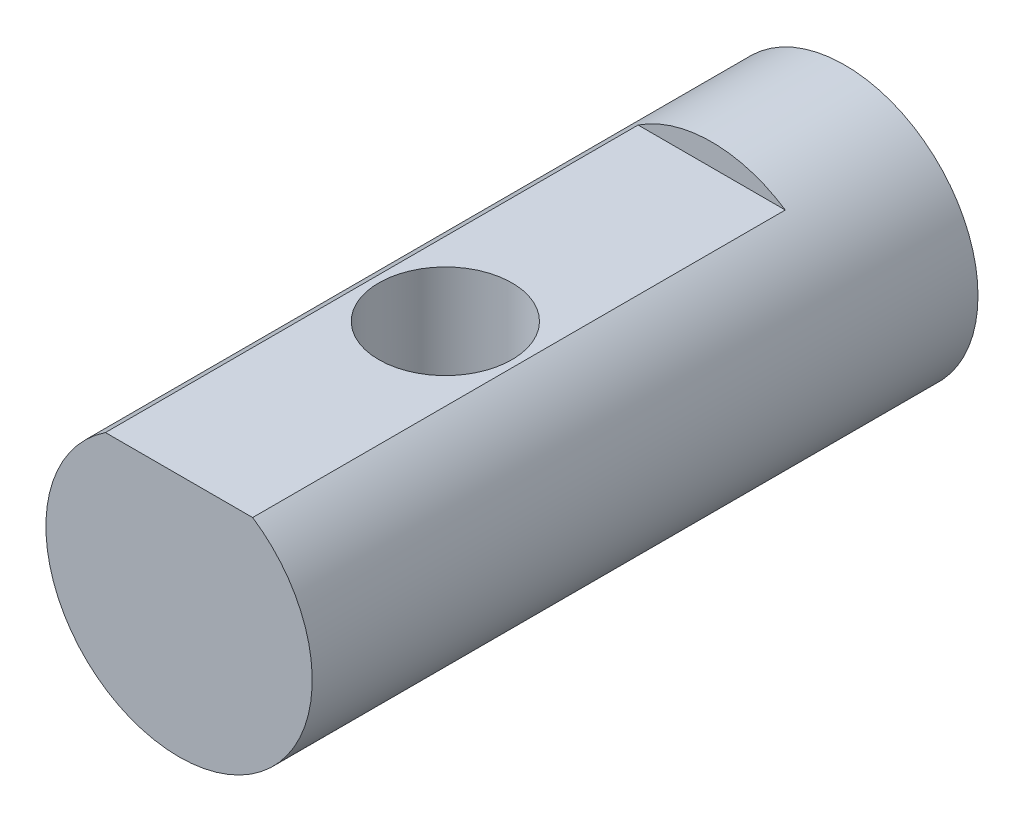
ISO-10303-21;
HEADER;
FILE_DESCRIPTION(('STEP AP214'),'2;1');
FILE_NAME('part.step','',(''),(''),'','','');
FILE_SCHEMA(('AUTOMOTIVE_DESIGN { 1 0 10303 214 1 1 1 1 }'));
ENDSEC;
DATA;
#1=APPLICATION_CONTEXT('core data for automotive mechanical design processes');
#2=APPLICATION_PROTOCOL_DEFINITION('international standard','automotive_design',2000,#1);
#3=PRODUCT_CONTEXT('',#1,'mechanical');
#4=PRODUCT('Part','Part','',(#3));
#5=PRODUCT_RELATED_PRODUCT_CATEGORY('part','',(#4));
#6=PRODUCT_DEFINITION_FORMATION('','',#4);
#7=PRODUCT_DEFINITION_CONTEXT('part definition',#1,'design');
#8=PRODUCT_DEFINITION('design','',#6,#7);
#9=PRODUCT_DEFINITION_SHAPE('','',#8);
#10=(LENGTH_UNIT() NAMED_UNIT(*) SI_UNIT(.MILLI.,.METRE.));
#11=(NAMED_UNIT(*) PLANE_ANGLE_UNIT() SI_UNIT($,.RADIAN.));
#12=(NAMED_UNIT(*) SI_UNIT($,.STERADIAN.) SOLID_ANGLE_UNIT());
#13=UNCERTAINTY_MEASURE_WITH_UNIT(LENGTH_MEASURE(1.E-05),#10,'distance_accuracy_value','');
#14=(GEOMETRIC_REPRESENTATION_CONTEXT(3) GLOBAL_UNCERTAINTY_ASSIGNED_CONTEXT((#13)) GLOBAL_UNIT_ASSIGNED_CONTEXT((#10,
#11,#12)) REPRESENTATION_CONTEXT('',''));
#15=CARTESIAN_POINT('',(0.,0.,0.));
#16=DIRECTION('',(0.,0.,1.));
#17=DIRECTION('',(1.,0.,0.));
#18=AXIS2_PLACEMENT_3D('',#15,#16,#17);
#19=CARTESIAN_POINT('',(0.,0.,15.));
#20=DIRECTION('',(0.,0.,-1.));
#21=DIRECTION('',(-1.,0.,0.));
#22=AXIS2_PLACEMENT_3D('',#19,#20,#21);
#23=CYLINDRICAL_SURFACE('',#22,3.);
#24=CARTESIAN_POINT('',(0.,-3.,10.5));
#25=CARTESIAN_POINT('',(0.0788579444268497,-2.99999570107562,10.4999950465242));
#26=CARTESIAN_POINT('',(0.157809899546343,-2.99685736529634,10.4937448903184));
#27=CARTESIAN_POINT('',(0.313380352903344,-2.98461234055735,10.4690206794877));
#28=CARTESIAN_POINT('',(0.389994130070444,-2.97549431743379,10.4505234105033));
#29=CARTESIAN_POINT('',(0.538400317320673,-2.95224419105063,10.4022092870751));
#30=CARTESIAN_POINT('',(0.610210204408719,-2.93813158766306,10.372436423628));
#31=CARTESIAN_POINT('',(0.747708925209898,-2.90618664773642,10.3026440679525));
#32=CARTESIAN_POINT('',(0.813398240985088,-2.88835460450288,10.2626253836267));
#33=CARTESIAN_POINT('',(0.941261726642863,-2.84934387387093,10.1707241257721));
#34=CARTESIAN_POINT('',(1.00298281668316,-2.82802798691306,10.1182702811405));
#35=CARTESIAN_POINT('',(1.11716916730047,-2.78489955370114,10.0042177811294));
#36=CARTESIAN_POINT('',(1.16962737466015,-2.76308664313552,9.94261222234134));
#37=CARTESIAN_POINT('',(1.26787800067542,-2.71948426796021,9.80627497571493));
#38=CARTESIAN_POINT('',(1.31283800332745,-2.69782780455198,9.73089585248113));
#39=CARTESIAN_POINT('',(1.38925234033604,-2.65928968158481,9.57244899602068));
#40=CARTESIAN_POINT('',(1.4207163224495,-2.64240461410484,9.48938680691588));
#41=CARTESIAN_POINT('',(1.46719866328288,-2.61686800556713,9.32300234186712));
#42=CARTESIAN_POINT('',(1.48308878562066,-2.6077840737557,9.23999332189891));
#43=CARTESIAN_POINT('',(1.50064048996327,-2.59772834922792,9.07203174333078));
#44=CARTESIAN_POINT('',(1.50231613255961,-2.59674854014932,8.98708118869327));
#45=CARTESIAN_POINT('',(1.49203093075844,-2.60266395385873,8.82857096352695));
#46=CARTESIAN_POINT('',(1.48167683930523,-2.6086314549302,8.75486395316542));
#47=CARTESIAN_POINT('',(1.4504097735854,-2.62614343100775,8.61041713594044));
#48=CARTESIAN_POINT('',(1.42949343584648,-2.63768968247664,8.53967828204203));
#49=CARTESIAN_POINT('',(1.37731467057901,-2.66531214619111,8.40115630115151));
#50=CARTESIAN_POINT('',(1.34582260067399,-2.68148760995998,8.33348040182132));
#51=CARTESIAN_POINT('',(1.273562531502,-2.71655106422105,8.20404856111499));
#52=CARTESIAN_POINT('',(1.2327903657187,-2.73544027170286,8.14229529659987));
#53=CARTESIAN_POINT('',(1.13709908236918,-2.77669736854929,8.01821812088516));
#54=CARTESIAN_POINT('',(1.08104168755392,-2.79920265355119,7.95681468963576));
#55=CARTESIAN_POINT('',(0.95933336811206,-2.84321434950611,7.84389687211365));
#56=CARTESIAN_POINT('',(0.893677884861429,-2.86472027938201,7.79238721194918));
#57=CARTESIAN_POINT('',(0.750774758747774,-2.90552980924446,7.69847150845541));
#58=CARTESIAN_POINT('',(0.673130387399114,-2.92468476243011,7.65659929133139));
#59=CARTESIAN_POINT('',(0.510699323233196,-2.95736821681863,7.58685445643549));
#60=CARTESIAN_POINT('',(0.425918364397914,-2.9709011841533,7.55897072247725));
#61=CARTESIAN_POINT('',(0.259149737491053,-2.98986500612153,7.52028689442498));
#62=CARTESIAN_POINT('',(0.177512295822489,-2.99587407451965,7.50826314637983));
#63=CARTESIAN_POINT('',(0.0131693999240273,-3.00109520188655,7.49780290329827));
#64=CARTESIAN_POINT('',(-0.0695355298048632,-3.00031048081978,7.4993599715408));
#65=CARTESIAN_POINT('',(-0.22684945797898,-2.99236788380152,7.51531003262811));
#66=CARTESIAN_POINT('',(-0.301589112074895,-2.98570868532252,7.52869879909499));
#67=CARTESIAN_POINT('',(-0.447610338452912,-2.9673325697226,7.56635710784268));
#68=CARTESIAN_POINT('',(-0.518891528536631,-2.95561509501618,7.59062784968024));
#69=CARTESIAN_POINT('',(-0.658332912674359,-2.92776377120382,7.64999769964955));
#70=CARTESIAN_POINT('',(-0.726345595508705,-2.91151322654446,7.68538657517443));
#71=CARTESIAN_POINT('',(-0.855692042548907,-2.87615961476126,7.76566130346985));
#72=CARTESIAN_POINT('',(-0.917022944664888,-2.85705533350407,7.81055120189309));
#73=CARTESIAN_POINT('',(-1.03765153393382,-2.81562332004297,7.91364063799607));
#74=CARTESIAN_POINT('',(-1.09615811672854,-2.79316327265249,7.97271430266772));
#75=CARTESIAN_POINT('',(-1.20278448167828,-2.7489358741323,8.09988772691659));
#76=CARTESIAN_POINT('',(-1.25089707856781,-2.7271690110007,8.16799367827188));
#77=CARTESIAN_POINT('',(-1.33756187171853,-2.68576788309734,8.31546548125946));
#78=CARTESIAN_POINT('',(-1.37553824370037,-2.66628794383591,8.39521689914172));
#79=CARTESIAN_POINT('',(-1.43712423890206,-2.63361108441202,8.56126510136245));
#80=CARTESIAN_POINT('',(-1.46075237380053,-2.62040607332625,8.64755328970034));
#81=CARTESIAN_POINT('',(-1.49079253120031,-2.60342251538703,8.81536533432705));
#82=CARTESIAN_POINT('',(-1.49863949460818,-2.59886075197597,8.89655138015286));
#83=CARTESIAN_POINT('',(-1.5010337315643,-2.59748031962405,9.05917060074679));
#84=CARTESIAN_POINT('',(-1.49558676993486,-2.60065829439585,9.14060365310679));
#85=CARTESIAN_POINT('',(-1.47288918838997,-2.61356793076615,9.29322525230015));
#86=CARTESIAN_POINT('',(-1.45681247151455,-2.62264641723988,9.36465070521711));
#87=CARTESIAN_POINT('',(-1.41476303733662,-2.64556524281479,9.50371217913655));
#88=CARTESIAN_POINT('',(-1.38878713673988,-2.65940711354503,9.57134697313804));
#89=CARTESIAN_POINT('',(-1.32572361795085,-2.69142795546803,9.7059372764798));
#90=CARTESIAN_POINT('',(-1.28800670672355,-2.70983583593881,9.77254185274354));
#91=CARTESIAN_POINT('',(-1.20322645745609,-2.7485299745229,9.89891180427188));
#92=CARTESIAN_POINT('',(-1.15615825686234,-2.76881720693416,9.95867359578167));
#93=CARTESIAN_POINT('',(-1.04730498999206,-2.81193484737138,10.077212973532));
#94=CARTESIAN_POINT('',(-0.984426634495894,-2.83477474959942,10.1349886535254));
#95=CARTESIAN_POINT('',(-0.849232209349797,-2.87816628389896,10.2393944751529));
#96=CARTESIAN_POINT('',(-0.776911084957798,-2.89871667939292,10.2860186092049));
#97=CARTESIAN_POINT('',(-0.62389739517442,-2.93547014349806,10.3668545440681));
#98=CARTESIAN_POINT('',(-0.543149255665098,-2.95164144740899,10.4009762538547));
#99=CARTESIAN_POINT('',(-0.376113151707132,-2.9775201194848,10.4547122516361));
#100=CARTESIAN_POINT('',(-0.289841699383651,-2.98724585044602,10.4743677702086));
#101=CARTESIAN_POINT('',(-0.168902919736343,-2.99543192870217,10.4908461166286));
#102=CARTESIAN_POINT('',(-0.135242819162348,-2.99714048010376,10.4942739612995));
#103=CARTESIAN_POINT('',(-0.0677275977076375,-2.99942545465223,10.4988519982711));
#104=CARTESIAN_POINT('',(-0.0338724714699429,-3.00000184655071,10.5000021277053));
#105=CARTESIAN_POINT('',(0.,-3.,10.5));
#106=B_SPLINE_CURVE_WITH_KNOTS('',3,(#24,#25,#26,#27,#28,#29,#30,#31,#32,#33,#34,#35,#36,#37,
#38,#39,#40,#41,#42,#43,#44,#45,#46,#47,#48,#49,#50,#51,#52,#53,#54,#55,#56,#57,#58,#59,#60,#61,
#62,#63,#64,#65,#66,#67,#68,#69,#70,#71,#72,#73,#74,#75,#76,#77,#78,#79,#80,#81,#82,#83,#84,#85,
#86,#87,#88,#89,#90,#91,#92,#93,#94,#95,#96,#97,#98,#99,#100,#101,#102,#103,#104,#105),
.UNSPECIFIED.,.T.,.F.,(4,2,2,2,2,2,2,2,2,2,2,2,2,2,2,2,2,2,2,2,2,2,2,2,2,2,2,2,2,2,2,2,2,2,2,2,
2,2,2,2,4),(0.,0.236436386130439,0.473322224563796,0.709293233238448,0.945245640872352,
1.19547263807713,1.44588935648105,1.71572589646129,1.98536921847421,2.23887018210344,
2.49212035993531,2.71508568613981,2.93812205888517,3.16635360252731,3.39468781890333,
3.65197412000818,3.90938301898029,4.17874533321661,4.44789325368419,4.69474935707018,
4.94148846767214,5.16910359759183,5.39674382446397,5.63089284041848,5.86514176122509,
6.12239415966628,6.37982382923148,6.64972023242589,6.91926767918176,7.1629396125457,
7.40650589797017,7.62686895373283,7.84730293182526,8.0825468517043,8.31791341715446,
8.58187864135757,8.84598575071868,9.1119602049529,9.37717362931724,9.47872920200875,
9.58028757766599),.UNSPECIFIED.);
#107=CARTESIAN_POINT('',(0.,-3.,10.5));
#108=VERTEX_POINT('',#107);
#109=EDGE_CURVE('E64',#108,#108,#106,.T.);
#110=ORIENTED_EDGE('',*,*,#109,.T.);
#111=EDGE_LOOP('',(#110));
#112=FACE_BOUND('',#111,.T.);
#113=CARTESIAN_POINT('',(0.,0.,15.));
#114=DIRECTION('',(0.,0.,1.));
#115=DIRECTION('',(1.,0.,0.));
#116=AXIS2_PLACEMENT_3D('',#113,#114,#115);
#117=CIRCLE('',#116,3.);
#118=CARTESIAN_POINT('',(-1.6583123951777,2.5,15.));
#119=VERTEX_POINT('',#118);
#120=CARTESIAN_POINT('',(1.6583123951777,2.5,15.));
#121=VERTEX_POINT('',#120);
#122=EDGE_CURVE('E11',#119,#121,#117,.T.);
#123=ORIENTED_EDGE('',*,*,#122,.F.);
#124=DIRECTION('',(0.,0.,1.));
#125=VECTOR('',#124,1.);
#126=CARTESIAN_POINT('',(-1.6583123951777,2.5,3.));
#127=LINE('',#126,#125);
#128=CARTESIAN_POINT('',(-1.6583123951777,2.5,3.));
#129=VERTEX_POINT('',#128);
#130=EDGE_CURVE('E48',#129,#119,#127,.T.);
#131=ORIENTED_EDGE('',*,*,#130,.F.);
#132=CARTESIAN_POINT('',(0.,0.,3.));
#133=DIRECTION('',(0.,0.,1.));
#134=DIRECTION('',(1.,0.,0.));
#135=AXIS2_PLACEMENT_3D('',#132,#133,#134);
#136=CIRCLE('',#135,3.);
#137=CARTESIAN_POINT('',(1.6583123951777,2.5,3.));
#138=VERTEX_POINT('',#137);
#139=EDGE_CURVE('E63',#138,#129,#136,.T.);
#140=ORIENTED_EDGE('',*,*,#139,.F.);
#141=DIRECTION('',(0.,0.,1.));
#142=VECTOR('',#141,1.);
#143=CARTESIAN_POINT('',(1.6583123951777,2.5,3.));
#144=LINE('',#143,#142);
#145=EDGE_CURVE('E54',#138,#121,#144,.T.);
#146=ORIENTED_EDGE('',*,*,#145,.T.);
#147=EDGE_LOOP('',(#123,#131,#140,#146));
#148=FACE_BOUND('',#147,.T.);
#149=CARTESIAN_POINT('',(0.,0.,0.));
#150=DIRECTION('',(0.,0.,1.));
#151=DIRECTION('',(1.,0.,0.));
#152=AXIS2_PLACEMENT_3D('',#149,#150,#151);
#153=CIRCLE('',#152,3.);
#154=CARTESIAN_POINT('',(3.,0.,0.));
#155=VERTEX_POINT('',#154);
#156=EDGE_CURVE('E37',#155,#155,#153,.T.);
#157=ORIENTED_EDGE('',*,*,#156,.T.);
#158=EDGE_LOOP('',(#157));
#159=FACE_BOUND('',#158,.T.);
#160=ADVANCED_FACE('F33',(#112,#148,#159),#23,.T.);
#161=CARTESIAN_POINT('',(0.,0.,15.));
#162=DIRECTION('',(0.,0.,1.));
#163=DIRECTION('',(1.,0.,0.));
#164=AXIS2_PLACEMENT_3D('',#161,#162,#163);
#165=PLANE('',#164);
#166=DIRECTION('',(1.,0.,0.));
#167=VECTOR('',#166,1.);
#168=CARTESIAN_POINT('',(-1.6583123951777,2.5,15.));
#169=LINE('',#168,#167);
#170=EDGE_CURVE('E59',#119,#121,#169,.T.);
#171=ORIENTED_EDGE('',*,*,#170,.F.);
#172=ORIENTED_EDGE('',*,*,#122,.T.);
#173=EDGE_LOOP('',(#171,#172));
#174=FACE_BOUND('',#173,.T.);
#175=ADVANCED_FACE('F70',(#174),#165,.T.);
#176=CARTESIAN_POINT('',(0.,0.,0.));
#177=DIRECTION('',(0.,0.,1.));
#178=DIRECTION('',(1.,0.,0.));
#179=AXIS2_PLACEMENT_3D('',#176,#177,#178);
#180=PLANE('',#179);
#181=ORIENTED_EDGE('',*,*,#156,.F.);
#182=EDGE_LOOP('',(#181));
#183=FACE_BOUND('',#182,.T.);
#184=ADVANCED_FACE('F72',(#183),#180,.F.);
#185=CARTESIAN_POINT('',(-1.6583123951777,2.5,3.));
#186=DIRECTION('',(0.,-1.,0.));
#187=DIRECTION('',(0.,0.,-1.));
#188=AXIS2_PLACEMENT_3D('',#185,#186,#187);
#189=PLANE('',#188);
#190=CARTESIAN_POINT('',(0.,2.5,9.));
#191=DIRECTION('',(0.,1.,0.));
#192=DIRECTION('',(0.,0.,1.));
#193=AXIS2_PLACEMENT_3D('',#190,#191,#192);
#194=CIRCLE('',#193,1.5);
#195=CARTESIAN_POINT('',(0.,2.5,10.5));
#196=VERTEX_POINT('',#195);
#197=EDGE_CURVE('E99',#196,#196,#194,.T.);
#198=ORIENTED_EDGE('',*,*,#197,.F.);
#199=EDGE_LOOP('',(#198));
#200=FACE_BOUND('',#199,.T.);
#201=ORIENTED_EDGE('',*,*,#170,.T.);
#202=ORIENTED_EDGE('',*,*,#145,.F.);
#203=DIRECTION('',(1.,0.,0.));
#204=VECTOR('',#203,1.);
#205=CARTESIAN_POINT('',(-1.6583123951777,2.5,3.));
#206=LINE('',#205,#204);
#207=EDGE_CURVE('E101',#129,#138,#206,.T.);
#208=ORIENTED_EDGE('',*,*,#207,.F.);
#209=ORIENTED_EDGE('',*,*,#130,.T.);
#210=EDGE_LOOP('',(#201,#202,#208,#209));
#211=FACE_BOUND('',#210,.T.);
#212=ADVANCED_FACE('F60',(#200,#211),#189,.F.);
#213=CARTESIAN_POINT('',(0.,0.,3.));
#214=DIRECTION('',(0.,0.,1.));
#215=DIRECTION('',(1.,0.,0.));
#216=AXIS2_PLACEMENT_3D('',#213,#214,#215);
#217=PLANE('',#216);
#218=ORIENTED_EDGE('',*,*,#139,.T.);
#219=ORIENTED_EDGE('',*,*,#207,.T.);
#220=EDGE_LOOP('',(#218,#219));
#221=FACE_BOUND('',#220,.T.);
#222=ADVANCED_FACE('F83',(#221),#217,.T.);
#223=CARTESIAN_POINT('',(0.,-3.5,9.));
#224=DIRECTION('',(0.,1.,0.));
#225=DIRECTION('',(0.,0.,1.));
#226=AXIS2_PLACEMENT_3D('',#223,#224,#225);
#227=CYLINDRICAL_SURFACE('',#226,1.5);
#228=ORIENTED_EDGE('',*,*,#197,.T.);
#229=EDGE_LOOP('',(#228));
#230=FACE_BOUND('',#229,.T.);
#231=ORIENTED_EDGE('',*,*,#109,.F.);
#232=EDGE_LOOP('',(#231));
#233=FACE_BOUND('',#232,.T.);
#234=ADVANCED_FACE('F87',(#230,#233),#227,.F.);
#235=CLOSED_SHELL('',(#160,#175,#184,#212,#222,#234));
#236=MANIFOLD_SOLID_BREP('B2',#235);
#237=ADVANCED_BREP_SHAPE_REPRESENTATION('',(#18,#236),#14);
#238=SHAPE_DEFINITION_REPRESENTATION(#9,#237);
ENDSEC;
END-ISO-10303-21;
